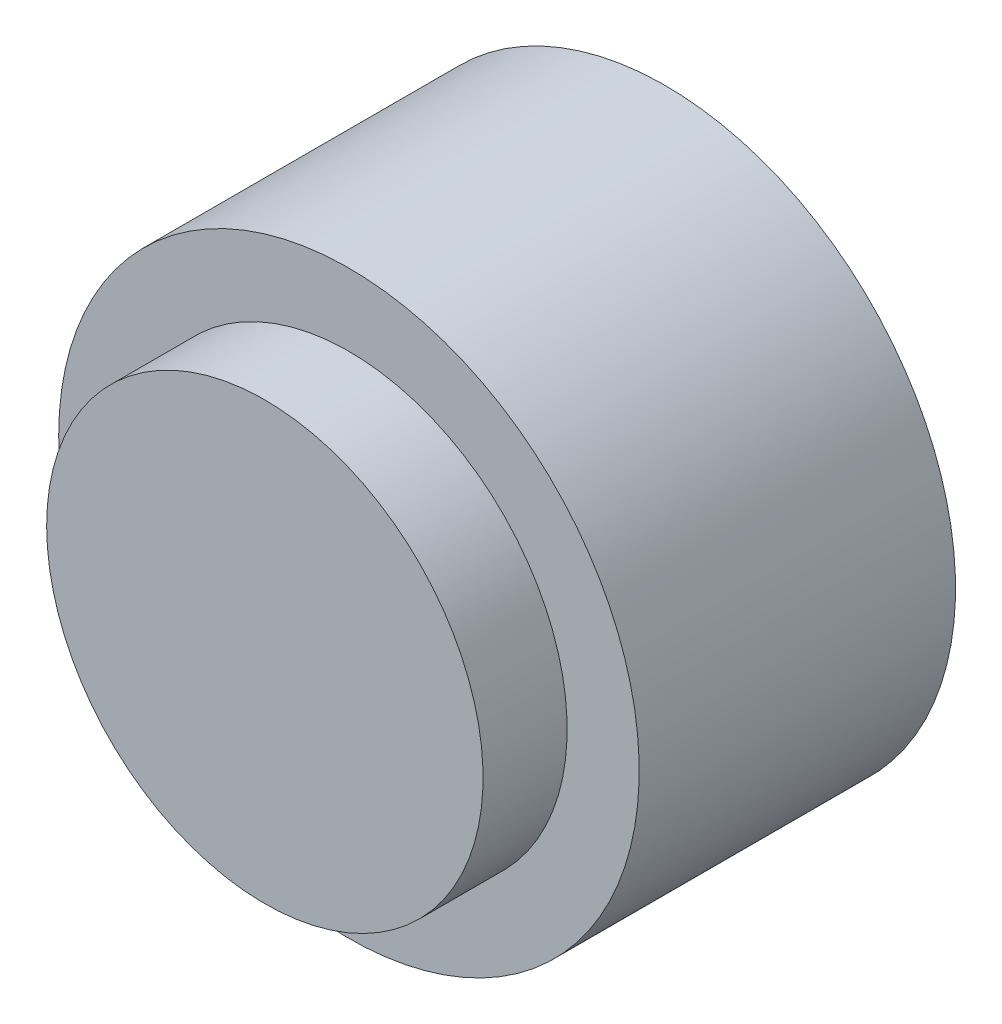
ISO-10303-21;
HEADER;
FILE_DESCRIPTION(('STEP AP214'),'2;1');
FILE_NAME('part.step','',(''),(''),'','','');
FILE_SCHEMA(('AUTOMOTIVE_DESIGN { 1 0 10303 214 1 1 1 1 }'));
ENDSEC;
DATA;
#1=APPLICATION_CONTEXT('core data for automotive mechanical design processes');
#2=APPLICATION_PROTOCOL_DEFINITION('international standard','automotive_design',2000,#1);
#3=PRODUCT_CONTEXT('',#1,'mechanical');
#4=PRODUCT('Part','Part','',(#3));
#5=PRODUCT_RELATED_PRODUCT_CATEGORY('part','',(#4));
#6=PRODUCT_DEFINITION_FORMATION('','',#4);
#7=PRODUCT_DEFINITION_CONTEXT('part definition',#1,'design');
#8=PRODUCT_DEFINITION('design','',#6,#7);
#9=PRODUCT_DEFINITION_SHAPE('','',#8);
#10=(LENGTH_UNIT() NAMED_UNIT(*) SI_UNIT(.MILLI.,.METRE.));
#11=(NAMED_UNIT(*) PLANE_ANGLE_UNIT() SI_UNIT($,.RADIAN.));
#12=(NAMED_UNIT(*) SI_UNIT($,.STERADIAN.) SOLID_ANGLE_UNIT());
#13=UNCERTAINTY_MEASURE_WITH_UNIT(LENGTH_MEASURE(1.E-05),#10,'distance_accuracy_value','');
#14=(GEOMETRIC_REPRESENTATION_CONTEXT(3) GLOBAL_UNCERTAINTY_ASSIGNED_CONTEXT((#13)) GLOBAL_UNIT_ASSIGNED_CONTEXT((#10,
#11,#12)) REPRESENTATION_CONTEXT('',''));
#15=CARTESIAN_POINT('',(0.,0.,0.));
#16=DIRECTION('',(0.,0.,1.));
#17=DIRECTION('',(1.,0.,0.));
#18=AXIS2_PLACEMENT_3D('',#15,#16,#17);
#19=CARTESIAN_POINT('',(0.,0.,2.));
#20=DIRECTION('',(0.,0.,1.));
#21=DIRECTION('',(1.,0.,0.));
#22=AXIS2_PLACEMENT_3D('',#19,#20,#21);
#23=PLANE('',#22);
#24=CARTESIAN_POINT('',(0.,0.,2.));
#25=DIRECTION('',(0.,0.,1.));
#26=DIRECTION('',(1.,0.,0.));
#27=AXIS2_PLACEMENT_3D('',#24,#25,#26);
#28=CIRCLE('',#27,5.45);
#29=CARTESIAN_POINT('',(-5.45,0.,2.));
#30=VERTEX_POINT('',#29);
#31=EDGE_CURVE('E21',#30,#30,#28,.T.);
#32=ORIENTED_EDGE('',*,*,#31,.T.);
#33=EDGE_LOOP('',(#32));
#34=FACE_BOUND('',#33,.T.);
#35=ADVANCED_FACE('F17',(#34),#23,.T.);
#36=CARTESIAN_POINT('',(0.,0.,0.950000000000006));
#37=DIRECTION('',(0.,0.,1.));
#38=DIRECTION('',(1.,0.,0.));
#39=AXIS2_PLACEMENT_3D('',#36,#37,#38);
#40=CYLINDRICAL_SURFACE('',#39,5.45);
#41=ORIENTED_EDGE('',*,*,#31,.F.);
#42=DIRECTION('',(0.,0.,-1.));
#43=VECTOR('',#42,1.);
#44=CARTESIAN_POINT('',(-5.45,0.,0.950000000000006));
#45=LINE('',#44,#43);
#46=CARTESIAN_POINT('',(-5.45,0.,-0.099999999999989));
#47=VERTEX_POINT('',#46);
#48=EDGE_CURVE('E11',#30,#47,#45,.T.);
#49=ORIENTED_EDGE('',*,*,#48,.T.);
#50=CARTESIAN_POINT('',(0.,0.,-0.099999999999989));
#51=DIRECTION('',(0.,0.,1.));
#52=DIRECTION('',(1.,0.,0.));
#53=AXIS2_PLACEMENT_3D('',#50,#51,#52);
#54=CIRCLE('',#53,5.45);
#55=EDGE_CURVE('E59',#47,#47,#54,.T.);
#56=ORIENTED_EDGE('',*,*,#55,.T.);
#57=ORIENTED_EDGE('',*,*,#48,.F.);
#58=EDGE_LOOP('',(#41,#49,#56,#57));
#59=FACE_BOUND('',#58,.T.);
#60=ADVANCED_FACE('F93',(#59),#40,.T.);
#61=CARTESIAN_POINT('',(5.45000000000001,0.,-0.099999999999989));
#62=DIRECTION('',(0.,0.,1.));
#63=DIRECTION('',(1.,0.,0.));
#64=AXIS2_PLACEMENT_3D('',#61,#62,#63);
#65=PLANE('',#64);
#66=ORIENTED_EDGE('',*,*,#55,.F.);
#67=EDGE_LOOP('',(#66));
#68=FACE_BOUND('',#67,.T.);
#69=CARTESIAN_POINT('',(0.,0.,-0.099999999999989));
#70=DIRECTION('',(0.,0.,1.));
#71=DIRECTION('',(1.,0.,0.));
#72=AXIS2_PLACEMENT_3D('',#69,#70,#71);
#73=CIRCLE('',#72,7.25);
#74=CARTESIAN_POINT('',(-7.25000000000001,0.,-0.099999999999989));
#75=VERTEX_POINT('',#74);
#76=EDGE_CURVE('E57',#75,#75,#73,.T.);
#77=ORIENTED_EDGE('',*,*,#76,.T.);
#78=EDGE_LOOP('',(#77));
#79=FACE_BOUND('',#78,.T.);
#80=ADVANCED_FACE('F115',(#68,#79),#65,.T.);
#81=CARTESIAN_POINT('',(0.,0.,-4.05));
#82=DIRECTION('',(0.,0.,1.));
#83=DIRECTION('',(1.,0.,0.));
#84=AXIS2_PLACEMENT_3D('',#81,#82,#83);
#85=CYLINDRICAL_SURFACE('',#84,7.25);
#86=ORIENTED_EDGE('',*,*,#76,.F.);
#87=DIRECTION('',(0.,0.,-1.));
#88=VECTOR('',#87,1.);
#89=CARTESIAN_POINT('',(-7.25000000000001,0.,-4.05));
#90=LINE('',#89,#88);
#91=CARTESIAN_POINT('',(-7.25000000000001,0.,-8.00000000000001));
#92=VERTEX_POINT('',#91);
#93=EDGE_CURVE('E51',#75,#92,#90,.T.);
#94=ORIENTED_EDGE('',*,*,#93,.T.);
#95=CARTESIAN_POINT('',(0.,0.,-8.00000000000001));
#96=DIRECTION('',(0.,0.,1.));
#97=DIRECTION('',(1.,0.,0.));
#98=AXIS2_PLACEMENT_3D('',#95,#96,#97);
#99=CIRCLE('',#98,7.25);
#100=EDGE_CURVE('E56',#92,#92,#99,.T.);
#101=ORIENTED_EDGE('',*,*,#100,.T.);
#102=ORIENTED_EDGE('',*,*,#93,.F.);
#103=EDGE_LOOP('',(#86,#94,#101,#102));
#104=FACE_BOUND('',#103,.T.);
#105=ADVANCED_FACE('F19',(#104),#85,.T.);
#106=CARTESIAN_POINT('',(7.25000000000001,0.,-8.00000000000001));
#107=DIRECTION('',(0.,0.,-1.));
#108=DIRECTION('',(0.,-1.,0.));
#109=AXIS2_PLACEMENT_3D('',#106,#107,#108);
#110=PLANE('',#109);
#111=ORIENTED_EDGE('',*,*,#100,.F.);
#112=EDGE_LOOP('',(#111));
#113=FACE_BOUND('',#112,.T.);
#114=ADVANCED_FACE('F101',(#113),#110,.T.);
#115=CLOSED_SHELL('',(#35,#60,#80,#105,#114));
#116=MANIFOLD_SOLID_BREP('B1',#115);
#117=ADVANCED_BREP_SHAPE_REPRESENTATION('',(#18,#116),#14);
#118=SHAPE_DEFINITION_REPRESENTATION(#9,#117);
ENDSEC;
END-ISO-10303-21;
